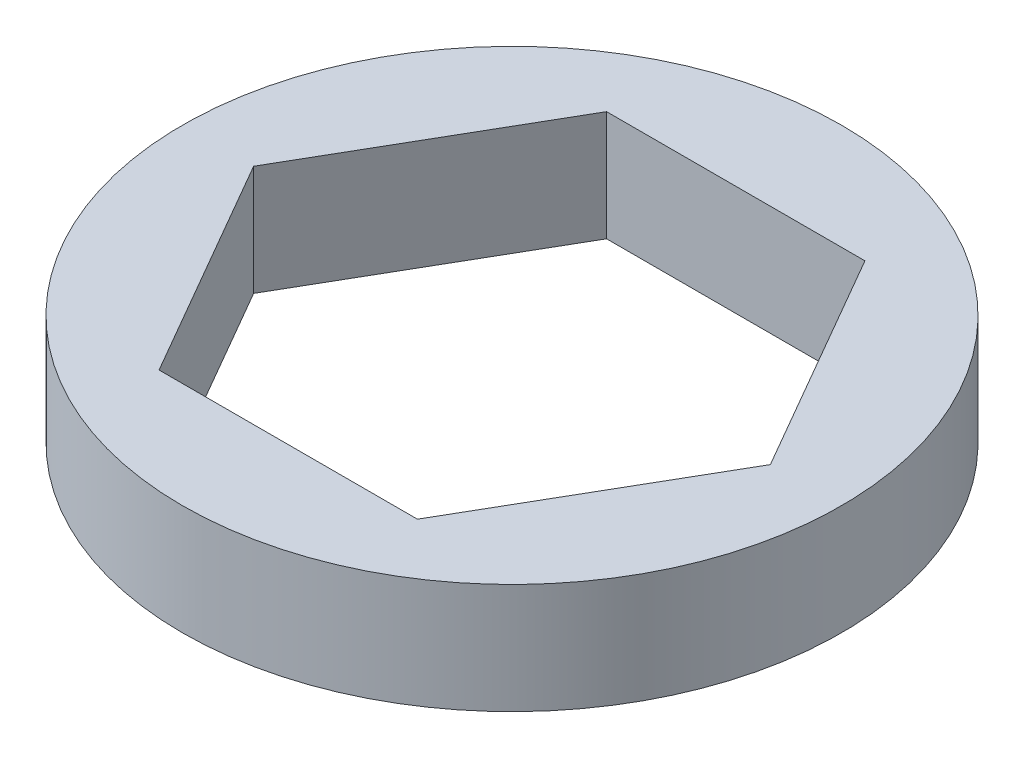
ISO-10303-21;
HEADER;
FILE_DESCRIPTION(('STEP AP214'),'2;1');
FILE_NAME('part.step','',(''),(''),'','','');
FILE_SCHEMA(('AUTOMOTIVE_DESIGN { 1 0 10303 214 1 1 1 1 }'));
ENDSEC;
DATA;
#1=APPLICATION_CONTEXT('core data for automotive mechanical design processes');
#2=APPLICATION_PROTOCOL_DEFINITION('international standard','automotive_design',2000,#1);
#3=PRODUCT_CONTEXT('',#1,'mechanical');
#4=PRODUCT('Part','Part','',(#3));
#5=PRODUCT_RELATED_PRODUCT_CATEGORY('part','',(#4));
#6=PRODUCT_DEFINITION_FORMATION('','',#4);
#7=PRODUCT_DEFINITION_CONTEXT('part definition',#1,'design');
#8=PRODUCT_DEFINITION('design','',#6,#7);
#9=PRODUCT_DEFINITION_SHAPE('','',#8);
#10=(LENGTH_UNIT() NAMED_UNIT(*) SI_UNIT(.MILLI.,.METRE.));
#11=(NAMED_UNIT(*) PLANE_ANGLE_UNIT() SI_UNIT($,.RADIAN.));
#12=(NAMED_UNIT(*) SI_UNIT($,.STERADIAN.) SOLID_ANGLE_UNIT());
#13=UNCERTAINTY_MEASURE_WITH_UNIT(LENGTH_MEASURE(1.E-05),#10,'distance_accuracy_value','');
#14=(GEOMETRIC_REPRESENTATION_CONTEXT(3) GLOBAL_UNCERTAINTY_ASSIGNED_CONTEXT((#13)) GLOBAL_UNIT_ASSIGNED_CONTEXT((#10,
#11,#12)) REPRESENTATION_CONTEXT('',''));
#15=CARTESIAN_POINT('',(0.,0.,0.));
#16=DIRECTION('',(0.,0.,1.));
#17=DIRECTION('',(1.,0.,0.));
#18=AXIS2_PLACEMENT_3D('',#15,#16,#17);
#19=CARTESIAN_POINT('',(0.,3.175,0.));
#20=DIRECTION('',(0.,1.,0.));
#21=DIRECTION('',(0.,0.,1.));
#22=AXIS2_PLACEMENT_3D('',#19,#20,#21);
#23=PLANE('',#22);
#24=CARTESIAN_POINT('',(0.,3.175,0.));
#25=DIRECTION('',(0.,1.,0.));
#26=DIRECTION('',(0.,0.,1.));
#27=AXIS2_PLACEMENT_3D('',#24,#25,#26);
#28=CIRCLE('',#27,9.5);
#29=CARTESIAN_POINT('',(0.,3.175,9.5));
#30=VERTEX_POINT('',#29);
#31=EDGE_CURVE('E11',#30,#30,#28,.T.);
#32=ORIENTED_EDGE('',*,*,#31,.T.);
#33=EDGE_LOOP('',(#32));
#34=FACE_BOUND('',#33,.T.);
#35=DIRECTION('',(-0.500000000000001,0.,-0.866025403784438));
#36=VECTOR('',#35,1.);
#37=CARTESIAN_POINT('',(7.44781847254615,3.175,0.));
#38=LINE('',#37,#36);
#39=CARTESIAN_POINT('',(7.44781847254615,3.175,0.));
#40=VERTEX_POINT('',#39);
#41=CARTESIAN_POINT('',(3.72390923627306,3.175,-6.44999999999999));
#42=VERTEX_POINT('',#41);
#43=EDGE_CURVE('E94',#40,#42,#38,.T.);
#44=ORIENTED_EDGE('',*,*,#43,.F.);
#45=DIRECTION('',(0.499999999999995,0.,-0.866025403784441));
#46=VECTOR('',#45,1.);
#47=CARTESIAN_POINT('',(3.72390923627315,3.175,6.44999999999994));
#48=LINE('',#47,#46);
#49=CARTESIAN_POINT('',(3.72390923627315,3.175,6.44999999999994));
#50=VERTEX_POINT('',#49);
#51=EDGE_CURVE('E86',#50,#40,#48,.T.);
#52=ORIENTED_EDGE('',*,*,#51,.F.);
#53=DIRECTION('',(1.,0.,0.));
#54=VECTOR('',#53,1.);
#55=CARTESIAN_POINT('',(-3.72390923627301,3.175,6.45000000000001));
#56=LINE('',#55,#54);
#57=CARTESIAN_POINT('',(-3.72390923627301,3.175,6.45000000000001));
#58=VERTEX_POINT('',#57);
#59=EDGE_CURVE('E114',#58,#50,#56,.T.);
#60=ORIENTED_EDGE('',*,*,#59,.F.);
#61=DIRECTION('',(0.500000000000007,0.,0.866025403784434));
#62=VECTOR('',#61,1.);
#63=CARTESIAN_POINT('',(-7.44781847254615,3.175,0.));
#64=LINE('',#63,#62);
#65=CARTESIAN_POINT('',(-7.44781847254615,3.175,0.));
#66=VERTEX_POINT('',#65);
#67=EDGE_CURVE('E112',#66,#58,#64,.T.);
#68=ORIENTED_EDGE('',*,*,#67,.F.);
#69=DIRECTION('',(-0.499999999999995,0.,0.866025403784442));
#70=VECTOR('',#69,1.);
#71=CARTESIAN_POINT('',(-3.7239092362731,3.175,-6.44999999999996));
#72=LINE('',#71,#70);
#73=CARTESIAN_POINT('',(-3.7239092362731,3.175,-6.44999999999996));
#74=VERTEX_POINT('',#73);
#75=EDGE_CURVE('E108',#74,#66,#72,.T.);
#76=ORIENTED_EDGE('',*,*,#75,.F.);
#77=DIRECTION('',(-1.,0.,0.));
#78=VECTOR('',#77,1.);
#79=CARTESIAN_POINT('',(3.72390923627306,3.175,-6.44999999999999));
#80=LINE('',#79,#78);
#81=EDGE_CURVE('E106',#42,#74,#80,.T.);
#82=ORIENTED_EDGE('',*,*,#81,.F.);
#83=EDGE_LOOP('',(#44,#52,#60,#68,#76,#82));
#84=FACE_BOUND('',#83,.T.);
#85=ADVANCED_FACE('F33',(#34,#84),#23,.T.);
#86=CARTESIAN_POINT('',(0.,0.,0.));
#87=DIRECTION('',(0.,1.,0.));
#88=DIRECTION('',(0.,0.,1.));
#89=AXIS2_PLACEMENT_3D('',#86,#87,#88);
#90=PLANE('',#89);
#91=CARTESIAN_POINT('',(0.,0.,0.));
#92=DIRECTION('',(0.,1.,0.));
#93=DIRECTION('',(0.,0.,1.));
#94=AXIS2_PLACEMENT_3D('',#91,#92,#93);
#95=CIRCLE('',#94,9.5);
#96=CARTESIAN_POINT('',(0.,0.,9.5));
#97=VERTEX_POINT('',#96);
#98=EDGE_CURVE('E37',#97,#97,#95,.T.);
#99=ORIENTED_EDGE('',*,*,#98,.F.);
#100=EDGE_LOOP('',(#99));
#101=FACE_BOUND('',#100,.T.);
#102=DIRECTION('',(0.499999999999995,0.,-0.866025403784441));
#103=VECTOR('',#102,1.);
#104=CARTESIAN_POINT('',(3.72390923627315,0.,6.44999999999994));
#105=LINE('',#104,#103);
#106=CARTESIAN_POINT('',(3.72390923627315,0.,6.44999999999994));
#107=VERTEX_POINT('',#106);
#108=CARTESIAN_POINT('',(7.44781847254615,0.,0.));
#109=VERTEX_POINT('',#108);
#110=EDGE_CURVE('E56',#107,#109,#105,.T.);
#111=ORIENTED_EDGE('',*,*,#110,.T.);
#112=DIRECTION('',(-0.500000000000001,0.,-0.866025403784438));
#113=VECTOR('',#112,1.);
#114=CARTESIAN_POINT('',(7.44781847254615,0.,0.));
#115=LINE('',#114,#113);
#116=CARTESIAN_POINT('',(3.72390923627306,0.,-6.44999999999999));
#117=VERTEX_POINT('',#116);
#118=EDGE_CURVE('E101',#109,#117,#115,.T.);
#119=ORIENTED_EDGE('',*,*,#118,.T.);
#120=DIRECTION('',(-1.,0.,0.));
#121=VECTOR('',#120,1.);
#122=CARTESIAN_POINT('',(3.72390923627306,0.,-6.44999999999999));
#123=LINE('',#122,#121);
#124=CARTESIAN_POINT('',(-3.7239092362731,0.,-6.44999999999996));
#125=VERTEX_POINT('',#124);
#126=EDGE_CURVE('E118',#117,#125,#123,.T.);
#127=ORIENTED_EDGE('',*,*,#126,.T.);
#128=DIRECTION('',(-0.499999999999995,0.,0.866025403784442));
#129=VECTOR('',#128,1.);
#130=CARTESIAN_POINT('',(-3.7239092362731,0.,-6.44999999999996));
#131=LINE('',#130,#129);
#132=CARTESIAN_POINT('',(-7.44781847254615,0.,0.));
#133=VERTEX_POINT('',#132);
#134=EDGE_CURVE('E121',#125,#133,#131,.T.);
#135=ORIENTED_EDGE('',*,*,#134,.T.);
#136=DIRECTION('',(0.500000000000007,0.,0.866025403784434));
#137=VECTOR('',#136,1.);
#138=CARTESIAN_POINT('',(-7.44781847254615,0.,0.));
#139=LINE('',#138,#137);
#140=CARTESIAN_POINT('',(-3.72390923627301,0.,6.45000000000001));
#141=VERTEX_POINT('',#140);
#142=EDGE_CURVE('E124',#133,#141,#139,.T.);
#143=ORIENTED_EDGE('',*,*,#142,.T.);
#144=DIRECTION('',(1.,0.,0.));
#145=VECTOR('',#144,1.);
#146=CARTESIAN_POINT('',(-3.72390923627301,0.,6.45000000000001));
#147=LINE('',#146,#145);
#148=EDGE_CURVE('E95',#141,#107,#147,.T.);
#149=ORIENTED_EDGE('',*,*,#148,.T.);
#150=EDGE_LOOP('',(#111,#119,#127,#135,#143,#149));
#151=FACE_BOUND('',#150,.T.);
#152=ADVANCED_FACE('F141',(#101,#151),#90,.F.);
#153=CARTESIAN_POINT('',(0.,3.175,0.));
#154=DIRECTION('',(0.,-1.,0.));
#155=DIRECTION('',(0.,0.,-1.));
#156=AXIS2_PLACEMENT_3D('',#153,#154,#155);
#157=CYLINDRICAL_SURFACE('',#156,9.5);
#158=ORIENTED_EDGE('',*,*,#31,.F.);
#159=EDGE_LOOP('',(#158));
#160=FACE_BOUND('',#159,.T.);
#161=ORIENTED_EDGE('',*,*,#98,.T.);
#162=EDGE_LOOP('',(#161));
#163=FACE_BOUND('',#162,.T.);
#164=ADVANCED_FACE('F35',(#160,#163),#157,.T.);
#165=CARTESIAN_POINT('',(3.72390923627315,3.175,6.44999999999994));
#166=DIRECTION('',(-0.866025403784441,0.,-0.499999999999995));
#167=DIRECTION('',(-0.499999999999995,0.,0.866025403784441));
#168=AXIS2_PLACEMENT_3D('',#165,#166,#167);
#169=PLANE('',#168);
#170=ORIENTED_EDGE('',*,*,#110,.F.);
#171=DIRECTION('',(0.,-1.,0.));
#172=VECTOR('',#171,1.);
#173=CARTESIAN_POINT('',(3.72390923627315,3.175,6.44999999999994));
#174=LINE('',#173,#172);
#175=EDGE_CURVE('E90',#50,#107,#174,.T.);
#176=ORIENTED_EDGE('',*,*,#175,.F.);
#177=ORIENTED_EDGE('',*,*,#51,.T.);
#178=DIRECTION('',(0.,-1.,0.));
#179=VECTOR('',#178,1.);
#180=CARTESIAN_POINT('',(7.44781847254615,3.175,0.));
#181=LINE('',#180,#179);
#182=EDGE_CURVE('E89',#40,#109,#181,.T.);
#183=ORIENTED_EDGE('',*,*,#182,.T.);
#184=EDGE_LOOP('',(#170,#176,#177,#183));
#185=FACE_BOUND('',#184,.T.);
#186=ADVANCED_FACE('F88',(#185),#169,.T.);
#187=CARTESIAN_POINT('',(7.44781847254615,3.175,0.));
#188=DIRECTION('',(-0.866025403784438,0.,0.500000000000001));
#189=DIRECTION('',(0.500000000000001,0.,0.866025403784438));
#190=AXIS2_PLACEMENT_3D('',#187,#188,#189);
#191=PLANE('',#190);
#192=ORIENTED_EDGE('',*,*,#118,.F.);
#193=ORIENTED_EDGE('',*,*,#182,.F.);
#194=ORIENTED_EDGE('',*,*,#43,.T.);
#195=DIRECTION('',(0.,-1.,0.));
#196=VECTOR('',#195,1.);
#197=CARTESIAN_POINT('',(3.72390923627306,3.175,-6.44999999999999));
#198=LINE('',#197,#196);
#199=EDGE_CURVE('E102',#42,#117,#198,.T.);
#200=ORIENTED_EDGE('',*,*,#199,.T.);
#201=EDGE_LOOP('',(#192,#193,#194,#200));
#202=FACE_BOUND('',#201,.T.);
#203=ADVANCED_FACE('F98',(#202),#191,.T.);
#204=CARTESIAN_POINT('',(3.72390923627306,3.175,-6.44999999999999));
#205=DIRECTION('',(0.,0.,1.));
#206=DIRECTION('',(1.,0.,0.));
#207=AXIS2_PLACEMENT_3D('',#204,#205,#206);
#208=PLANE('',#207);
#209=ORIENTED_EDGE('',*,*,#126,.F.);
#210=ORIENTED_EDGE('',*,*,#199,.F.);
#211=ORIENTED_EDGE('',*,*,#81,.T.);
#212=DIRECTION('',(0.,-1.,0.));
#213=VECTOR('',#212,1.);
#214=CARTESIAN_POINT('',(-3.7239092362731,3.175,-6.44999999999996));
#215=LINE('',#214,#213);
#216=EDGE_CURVE('E133',#74,#125,#215,.T.);
#217=ORIENTED_EDGE('',*,*,#216,.T.);
#218=EDGE_LOOP('',(#209,#210,#211,#217));
#219=FACE_BOUND('',#218,.T.);
#220=ADVANCED_FACE('F137',(#219),#208,.T.);
#221=CARTESIAN_POINT('',(-3.7239092362731,3.175,-6.44999999999996));
#222=DIRECTION('',(0.866025403784442,0.,0.499999999999995));
#223=DIRECTION('',(0.499999999999995,0.,-0.866025403784442));
#224=AXIS2_PLACEMENT_3D('',#221,#222,#223);
#225=PLANE('',#224);
#226=ORIENTED_EDGE('',*,*,#134,.F.);
#227=ORIENTED_EDGE('',*,*,#216,.F.);
#228=ORIENTED_EDGE('',*,*,#75,.T.);
#229=DIRECTION('',(0.,-1.,0.));
#230=VECTOR('',#229,1.);
#231=CARTESIAN_POINT('',(-7.44781847254615,3.175,0.));
#232=LINE('',#231,#230);
#233=EDGE_CURVE('E131',#66,#133,#232,.T.);
#234=ORIENTED_EDGE('',*,*,#233,.T.);
#235=EDGE_LOOP('',(#226,#227,#228,#234));
#236=FACE_BOUND('',#235,.T.);
#237=ADVANCED_FACE('F149',(#236),#225,.T.);
#238=CARTESIAN_POINT('',(-7.44781847254615,3.175,0.));
#239=DIRECTION('',(0.866025403784435,0.,-0.500000000000007));
#240=DIRECTION('',(-0.500000000000007,0.,-0.866025403784435));
#241=AXIS2_PLACEMENT_3D('',#238,#239,#240);
#242=PLANE('',#241);
#243=ORIENTED_EDGE('',*,*,#142,.F.);
#244=ORIENTED_EDGE('',*,*,#233,.F.);
#245=ORIENTED_EDGE('',*,*,#67,.T.);
#246=DIRECTION('',(0.,-1.,0.));
#247=VECTOR('',#246,1.);
#248=CARTESIAN_POINT('',(-3.72390923627301,3.175,6.45000000000001));
#249=LINE('',#248,#247);
#250=EDGE_CURVE('E48',#58,#141,#249,.T.);
#251=ORIENTED_EDGE('',*,*,#250,.T.);
#252=EDGE_LOOP('',(#243,#244,#245,#251));
#253=FACE_BOUND('',#252,.T.);
#254=ADVANCED_FACE('F147',(#253),#242,.T.);
#255=CARTESIAN_POINT('',(-3.72390923627301,3.175,6.45000000000001));
#256=DIRECTION('',(0.,0.,-1.));
#257=DIRECTION('',(-1.,0.,0.));
#258=AXIS2_PLACEMENT_3D('',#255,#256,#257);
#259=PLANE('',#258);
#260=ORIENTED_EDGE('',*,*,#148,.F.);
#261=ORIENTED_EDGE('',*,*,#250,.F.);
#262=ORIENTED_EDGE('',*,*,#59,.T.);
#263=ORIENTED_EDGE('',*,*,#175,.T.);
#264=EDGE_LOOP('',(#260,#261,#262,#263));
#265=FACE_BOUND('',#264,.T.);
#266=ADVANCED_FACE('F143',(#265),#259,.T.);
#267=CLOSED_SHELL('',(#85,#152,#164,#186,#203,#220,#237,#254,#266));
#268=MANIFOLD_SOLID_BREP('B2',#267);
#269=ADVANCED_BREP_SHAPE_REPRESENTATION('',(#18,#268),#14);
#270=SHAPE_DEFINITION_REPRESENTATION(#9,#269);
ENDSEC;
END-ISO-10303-21;
